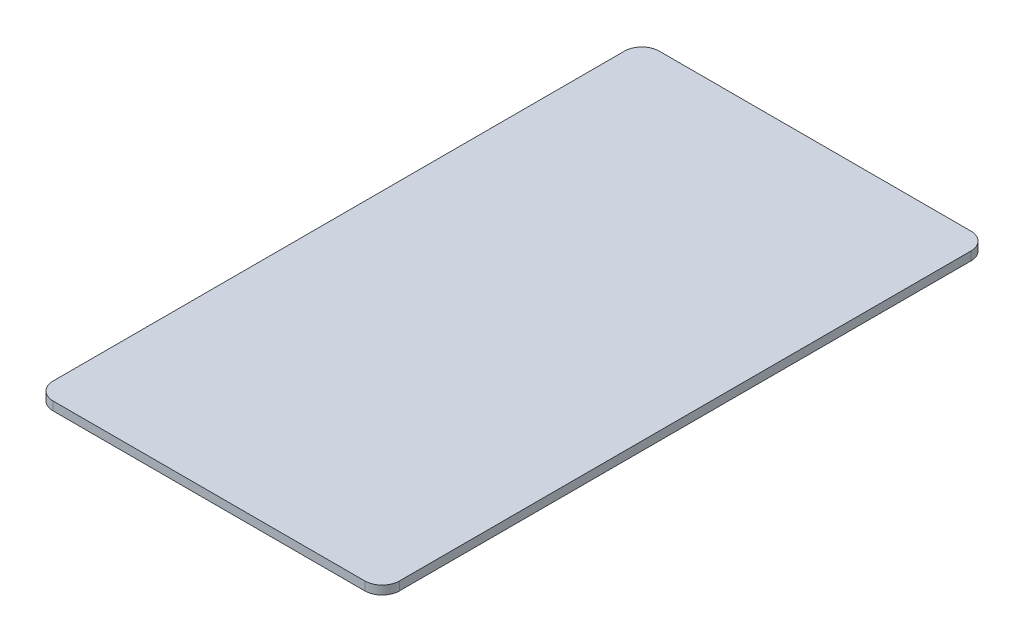
ISO-10303-21;
HEADER;
FILE_DESCRIPTION(('STEP AP214'),'2;1');
FILE_NAME('part.step','',(''),(''),'','','');
FILE_SCHEMA(('AUTOMOTIVE_DESIGN { 1 0 10303 214 1 1 1 1 }'));
ENDSEC;
DATA;
#1=APPLICATION_CONTEXT('core data for automotive mechanical design processes');
#2=APPLICATION_PROTOCOL_DEFINITION('international standard','automotive_design',2000,#1);
#3=PRODUCT_CONTEXT('',#1,'mechanical');
#4=PRODUCT('Part','Part','',(#3));
#5=PRODUCT_RELATED_PRODUCT_CATEGORY('part','',(#4));
#6=PRODUCT_DEFINITION_FORMATION('','',#4);
#7=PRODUCT_DEFINITION_CONTEXT('part definition',#1,'design');
#8=PRODUCT_DEFINITION('design','',#6,#7);
#9=PRODUCT_DEFINITION_SHAPE('','',#8);
#10=(LENGTH_UNIT() NAMED_UNIT(*) SI_UNIT(.MILLI.,.METRE.));
#11=(NAMED_UNIT(*) PLANE_ANGLE_UNIT() SI_UNIT($,.RADIAN.));
#12=(NAMED_UNIT(*) SI_UNIT($,.STERADIAN.) SOLID_ANGLE_UNIT());
#13=UNCERTAINTY_MEASURE_WITH_UNIT(LENGTH_MEASURE(1.E-05),#10,'distance_accuracy_value','');
#14=(GEOMETRIC_REPRESENTATION_CONTEXT(3) GLOBAL_UNCERTAINTY_ASSIGNED_CONTEXT((#13)) GLOBAL_UNIT_ASSIGNED_CONTEXT((#10,
#11,#12)) REPRESENTATION_CONTEXT('',''));
#15=CARTESIAN_POINT('',(0.,0.,0.));
#16=DIRECTION('',(0.,0.,1.));
#17=DIRECTION('',(1.,0.,0.));
#18=AXIS2_PLACEMENT_3D('',#15,#16,#17);
#19=CARTESIAN_POINT('',(20.,1.,35.));
#20=DIRECTION('',(-1.,0.,0.));
#21=DIRECTION('',(0.,0.,1.));
#22=AXIS2_PLACEMENT_3D('',#19,#20,#21);
#23=PLANE('',#22);
#24=DIRECTION('',(0.,0.,-1.));
#25=VECTOR('',#24,1.);
#26=CARTESIAN_POINT('',(20.,1.,35.));
#27=LINE('',#26,#25);
#28=CARTESIAN_POINT('',(20.,1.,33.));
#29=VERTEX_POINT('',#28);
#30=CARTESIAN_POINT('',(20.,1.,-33.));
#31=VERTEX_POINT('',#30);
#32=EDGE_CURVE('E140',#29,#31,#27,.T.);
#33=ORIENTED_EDGE('',*,*,#32,.F.);
#34=DIRECTION('',(0.,-1.,0.));
#35=VECTOR('',#34,1.);
#36=CARTESIAN_POINT('',(20.,1.,33.));
#37=LINE('',#36,#35);
#38=CARTESIAN_POINT('',(20.,0.,33.));
#39=VERTEX_POINT('',#38);
#40=EDGE_CURVE('E124',#29,#39,#37,.T.);
#41=ORIENTED_EDGE('',*,*,#40,.T.);
#42=DIRECTION('',(0.,0.,-1.));
#43=VECTOR('',#42,1.);
#44=CARTESIAN_POINT('',(20.,0.,35.));
#45=LINE('',#44,#43);
#46=CARTESIAN_POINT('',(20.,0.,-33.));
#47=VERTEX_POINT('',#46);
#48=EDGE_CURVE('E137',#39,#47,#45,.T.);
#49=ORIENTED_EDGE('',*,*,#48,.T.);
#50=DIRECTION('',(0.,-1.,0.));
#51=VECTOR('',#50,1.);
#52=CARTESIAN_POINT('',(20.,1.,-33.));
#53=LINE('',#52,#51);
#54=EDGE_CURVE('E143',#47,#31,#53,.F.);
#55=ORIENTED_EDGE('',*,*,#54,.T.);
#56=EDGE_LOOP('',(#33,#41,#49,#55));
#57=FACE_BOUND('',#56,.T.);
#58=ADVANCED_FACE('F52',(#57),#23,.F.);
#59=CARTESIAN_POINT('',(-20.,1.,-35.));
#60=DIRECTION('',(0.,0.,1.));
#61=DIRECTION('',(1.,0.,0.));
#62=AXIS2_PLACEMENT_3D('',#59,#60,#61);
#63=PLANE('',#62);
#64=DIRECTION('',(-1.,0.,0.));
#65=VECTOR('',#64,1.);
#66=CARTESIAN_POINT('',(-20.,1.,-35.));
#67=LINE('',#66,#65);
#68=CARTESIAN_POINT('',(18.,1.,-35.));
#69=VERTEX_POINT('',#68);
#70=CARTESIAN_POINT('',(-18.,1.,-35.));
#71=VERTEX_POINT('',#70);
#72=EDGE_CURVE('E200',#69,#71,#67,.T.);
#73=ORIENTED_EDGE('',*,*,#72,.F.);
#74=DIRECTION('',(0.,-1.,0.));
#75=VECTOR('',#74,1.);
#76=CARTESIAN_POINT('',(18.,1.,-35.));
#77=LINE('',#76,#75);
#78=CARTESIAN_POINT('',(18.,0.,-35.));
#79=VERTEX_POINT('',#78);
#80=EDGE_CURVE('E13',#69,#79,#77,.T.);
#81=ORIENTED_EDGE('',*,*,#80,.T.);
#82=DIRECTION('',(-1.,0.,0.));
#83=VECTOR('',#82,1.);
#84=CARTESIAN_POINT('',(-20.,0.,-35.));
#85=LINE('',#84,#83);
#86=CARTESIAN_POINT('',(-18.,0.,-35.));
#87=VERTEX_POINT('',#86);
#88=EDGE_CURVE('E149',#79,#87,#85,.T.);
#89=ORIENTED_EDGE('',*,*,#88,.T.);
#90=DIRECTION('',(0.,-1.,0.));
#91=VECTOR('',#90,1.);
#92=CARTESIAN_POINT('',(-18.,1.,-35.));
#93=LINE('',#92,#91);
#94=EDGE_CURVE('E61',#87,#71,#93,.F.);
#95=ORIENTED_EDGE('',*,*,#94,.T.);
#96=EDGE_LOOP('',(#73,#81,#89,#95));
#97=FACE_BOUND('',#96,.T.);
#98=ADVANCED_FACE('F199',(#97),#63,.F.);
#99=CARTESIAN_POINT('',(-20.,1.,35.));
#100=DIRECTION('',(1.,0.,0.));
#101=DIRECTION('',(0.,0.,-1.));
#102=AXIS2_PLACEMENT_3D('',#99,#100,#101);
#103=PLANE('',#102);
#104=DIRECTION('',(0.,0.,1.));
#105=VECTOR('',#104,1.);
#106=CARTESIAN_POINT('',(-20.,0.,35.));
#107=LINE('',#106,#105);
#108=CARTESIAN_POINT('',(-20.,0.,-33.));
#109=VERTEX_POINT('',#108);
#110=CARTESIAN_POINT('',(-20.,0.,33.));
#111=VERTEX_POINT('',#110);
#112=EDGE_CURVE('E154',#109,#111,#107,.T.);
#113=ORIENTED_EDGE('',*,*,#112,.T.);
#114=DIRECTION('',(0.,-1.,0.));
#115=VECTOR('',#114,1.);
#116=CARTESIAN_POINT('',(-20.,1.,33.));
#117=LINE('',#116,#115);
#118=CARTESIAN_POINT('',(-20.,1.,33.));
#119=VERTEX_POINT('',#118);
#120=EDGE_CURVE('E68',#111,#119,#117,.F.);
#121=ORIENTED_EDGE('',*,*,#120,.T.);
#122=DIRECTION('',(0.,0.,1.));
#123=VECTOR('',#122,1.);
#124=CARTESIAN_POINT('',(-20.,1.,35.));
#125=LINE('',#124,#123);
#126=CARTESIAN_POINT('',(-20.,1.,-33.));
#127=VERTEX_POINT('',#126);
#128=EDGE_CURVE('E207',#127,#119,#125,.T.);
#129=ORIENTED_EDGE('',*,*,#128,.F.);
#130=DIRECTION('',(0.,-1.,0.));
#131=VECTOR('',#130,1.);
#132=CARTESIAN_POINT('',(-20.,1.,-33.));
#133=LINE('',#132,#131);
#134=EDGE_CURVE('E189',#127,#109,#133,.T.);
#135=ORIENTED_EDGE('',*,*,#134,.T.);
#136=EDGE_LOOP('',(#113,#121,#129,#135));
#137=FACE_BOUND('',#136,.T.);
#138=ADVANCED_FACE('F211',(#137),#103,.F.);
#139=CARTESIAN_POINT('',(-20.,1.,35.));
#140=DIRECTION('',(0.,0.,-1.));
#141=DIRECTION('',(-1.,0.,0.));
#142=AXIS2_PLACEMENT_3D('',#139,#140,#141);
#143=PLANE('',#142);
#144=DIRECTION('',(1.,0.,0.));
#145=VECTOR('',#144,1.);
#146=CARTESIAN_POINT('',(-20.,0.,35.));
#147=LINE('',#146,#145);
#148=CARTESIAN_POINT('',(-18.,0.,35.));
#149=VERTEX_POINT('',#148);
#150=CARTESIAN_POINT('',(18.,0.,35.));
#151=VERTEX_POINT('',#150);
#152=EDGE_CURVE('E162',#149,#151,#147,.T.);
#153=ORIENTED_EDGE('',*,*,#152,.T.);
#154=DIRECTION('',(0.,-1.,0.));
#155=VECTOR('',#154,1.);
#156=CARTESIAN_POINT('',(18.,1.,35.));
#157=LINE('',#156,#155);
#158=CARTESIAN_POINT('',(18.,1.,35.));
#159=VERTEX_POINT('',#158);
#160=EDGE_CURVE('E125',#151,#159,#157,.F.);
#161=ORIENTED_EDGE('',*,*,#160,.T.);
#162=DIRECTION('',(1.,0.,0.));
#163=VECTOR('',#162,1.);
#164=CARTESIAN_POINT('',(-20.,1.,35.));
#165=LINE('',#164,#163);
#166=CARTESIAN_POINT('',(-18.,1.,35.));
#167=VERTEX_POINT('',#166);
#168=EDGE_CURVE('E157',#167,#159,#165,.T.);
#169=ORIENTED_EDGE('',*,*,#168,.F.);
#170=DIRECTION('',(0.,-1.,0.));
#171=VECTOR('',#170,1.);
#172=CARTESIAN_POINT('',(-18.,1.,35.));
#173=LINE('',#172,#171);
#174=EDGE_CURVE('E131',#167,#149,#173,.T.);
#175=ORIENTED_EDGE('',*,*,#174,.T.);
#176=EDGE_LOOP('',(#153,#161,#169,#175));
#177=FACE_BOUND('',#176,.T.);
#178=ADVANCED_FACE('F218',(#177),#143,.F.);
#179=CARTESIAN_POINT('',(0.,1.,0.));
#180=DIRECTION('',(0.,-1.,0.));
#181=DIRECTION('',(0.,0.,-1.));
#182=AXIS2_PLACEMENT_3D('',#179,#180,#181);
#183=PLANE('',#182);
#184=ORIENTED_EDGE('',*,*,#168,.T.);
#185=CARTESIAN_POINT('',(18.,1.,33.));
#186=DIRECTION('',(0.,-1.,0.));
#187=DIRECTION('',(0.,0.,-1.));
#188=AXIS2_PLACEMENT_3D('',#185,#186,#187);
#189=CIRCLE('',#188,2.);
#190=EDGE_CURVE('E186',#159,#29,#189,.F.);
#191=ORIENTED_EDGE('',*,*,#190,.T.);
#192=ORIENTED_EDGE('',*,*,#32,.T.);
#193=CARTESIAN_POINT('',(18.,1.,-33.));
#194=DIRECTION('',(0.,-1.,0.));
#195=DIRECTION('',(0.,0.,-1.));
#196=AXIS2_PLACEMENT_3D('',#193,#194,#195);
#197=CIRCLE('',#196,2.);
#198=EDGE_CURVE('E180',#31,#69,#197,.F.);
#199=ORIENTED_EDGE('',*,*,#198,.T.);
#200=ORIENTED_EDGE('',*,*,#72,.T.);
#201=CARTESIAN_POINT('',(-18.,1.,-33.));
#202=DIRECTION('',(0.,-1.,0.));
#203=DIRECTION('',(0.,0.,-1.));
#204=AXIS2_PLACEMENT_3D('',#201,#202,#203);
#205=CIRCLE('',#204,2.);
#206=EDGE_CURVE('E75',#71,#127,#205,.F.);
#207=ORIENTED_EDGE('',*,*,#206,.T.);
#208=ORIENTED_EDGE('',*,*,#128,.T.);
#209=CARTESIAN_POINT('',(-18.,1.,33.));
#210=DIRECTION('',(0.,-1.,0.));
#211=DIRECTION('',(0.,0.,-1.));
#212=AXIS2_PLACEMENT_3D('',#209,#210,#211);
#213=CIRCLE('',#212,2.);
#214=EDGE_CURVE('E183',#119,#167,#213,.F.);
#215=ORIENTED_EDGE('',*,*,#214,.T.);
#216=EDGE_LOOP('',(#184,#191,#192,#199,#200,#207,#208,#215));
#217=FACE_BOUND('',#216,.T.);
#218=ADVANCED_FACE('F204',(#217),#183,.F.);
#219=CARTESIAN_POINT('',(0.,0.,0.));
#220=DIRECTION('',(0.,-1.,0.));
#221=DIRECTION('',(0.,0.,-1.));
#222=AXIS2_PLACEMENT_3D('',#219,#220,#221);
#223=PLANE('',#222);
#224=ORIENTED_EDGE('',*,*,#48,.F.);
#225=CARTESIAN_POINT('',(18.,0.,33.));
#226=DIRECTION('',(0.,-1.,0.));
#227=DIRECTION('',(0.,0.,-1.));
#228=AXIS2_PLACEMENT_3D('',#225,#226,#227);
#229=CIRCLE('',#228,2.);
#230=EDGE_CURVE('E120',#39,#151,#229,.T.);
#231=ORIENTED_EDGE('',*,*,#230,.T.);
#232=ORIENTED_EDGE('',*,*,#152,.F.);
#233=CARTESIAN_POINT('',(-18.,0.,33.));
#234=DIRECTION('',(0.,-1.,0.));
#235=DIRECTION('',(0.,0.,-1.));
#236=AXIS2_PLACEMENT_3D('',#233,#234,#235);
#237=CIRCLE('',#236,2.);
#238=EDGE_CURVE('E132',#149,#111,#237,.T.);
#239=ORIENTED_EDGE('',*,*,#238,.T.);
#240=ORIENTED_EDGE('',*,*,#112,.F.);
#241=CARTESIAN_POINT('',(-18.,0.,-33.));
#242=DIRECTION('',(0.,-1.,0.));
#243=DIRECTION('',(0.,0.,-1.));
#244=AXIS2_PLACEMENT_3D('',#241,#242,#243);
#245=CIRCLE('',#244,2.);
#246=EDGE_CURVE('E142',#109,#87,#245,.T.);
#247=ORIENTED_EDGE('',*,*,#246,.T.);
#248=ORIENTED_EDGE('',*,*,#88,.F.);
#249=CARTESIAN_POINT('',(18.,0.,-33.));
#250=DIRECTION('',(0.,-1.,0.));
#251=DIRECTION('',(0.,0.,-1.));
#252=AXIS2_PLACEMENT_3D('',#249,#250,#251);
#253=CIRCLE('',#252,2.);
#254=EDGE_CURVE('E147',#79,#47,#253,.T.);
#255=ORIENTED_EDGE('',*,*,#254,.T.);
#256=EDGE_LOOP('',(#224,#231,#232,#239,#240,#247,#248,#255));
#257=FACE_BOUND('',#256,.T.);
#258=ADVANCED_FACE('F145',(#257),#223,.T.);
#259=CARTESIAN_POINT('',(18.,1.,33.));
#260=DIRECTION('',(0.,-1.,0.));
#261=DIRECTION('',(0.,0.,-1.));
#262=AXIS2_PLACEMENT_3D('',#259,#260,#261);
#263=CYLINDRICAL_SURFACE('',#262,2.);
#264=ORIENTED_EDGE('',*,*,#190,.F.);
#265=ORIENTED_EDGE('',*,*,#160,.F.);
#266=ORIENTED_EDGE('',*,*,#230,.F.);
#267=ORIENTED_EDGE('',*,*,#40,.F.);
#268=EDGE_LOOP('',(#264,#265,#266,#267));
#269=FACE_BOUND('',#268,.T.);
#270=ADVANCED_FACE('F123',(#269),#263,.T.);
#271=CARTESIAN_POINT('',(-18.,1.,33.));
#272=DIRECTION('',(0.,-1.,0.));
#273=DIRECTION('',(0.,0.,-1.));
#274=AXIS2_PLACEMENT_3D('',#271,#272,#273);
#275=CYLINDRICAL_SURFACE('',#274,2.);
#276=ORIENTED_EDGE('',*,*,#214,.F.);
#277=ORIENTED_EDGE('',*,*,#120,.F.);
#278=ORIENTED_EDGE('',*,*,#238,.F.);
#279=ORIENTED_EDGE('',*,*,#174,.F.);
#280=EDGE_LOOP('',(#276,#277,#278,#279));
#281=FACE_BOUND('',#280,.T.);
#282=ADVANCED_FACE('F215',(#281),#275,.T.);
#283=CARTESIAN_POINT('',(18.,1.,-33.));
#284=DIRECTION('',(0.,-1.,0.));
#285=DIRECTION('',(0.,0.,-1.));
#286=AXIS2_PLACEMENT_3D('',#283,#284,#285);
#287=CYLINDRICAL_SURFACE('',#286,2.);
#288=ORIENTED_EDGE('',*,*,#198,.F.);
#289=ORIENTED_EDGE('',*,*,#54,.F.);
#290=ORIENTED_EDGE('',*,*,#254,.F.);
#291=ORIENTED_EDGE('',*,*,#80,.F.);
#292=EDGE_LOOP('',(#288,#289,#290,#291));
#293=FACE_BOUND('',#292,.T.);
#294=ADVANCED_FACE('F227',(#293),#287,.T.);
#295=CARTESIAN_POINT('',(-18.,1.,-33.));
#296=DIRECTION('',(0.,-1.,0.));
#297=DIRECTION('',(0.,0.,-1.));
#298=AXIS2_PLACEMENT_3D('',#295,#296,#297);
#299=CYLINDRICAL_SURFACE('',#298,2.);
#300=ORIENTED_EDGE('',*,*,#206,.F.);
#301=ORIENTED_EDGE('',*,*,#94,.F.);
#302=ORIENTED_EDGE('',*,*,#246,.F.);
#303=ORIENTED_EDGE('',*,*,#134,.F.);
#304=EDGE_LOOP('',(#300,#301,#302,#303));
#305=FACE_BOUND('',#304,.T.);
#306=ADVANCED_FACE('F54',(#305),#299,.T.);
#307=CLOSED_SHELL('',(#58,#98,#138,#178,#218,#258,#270,#282,#294,#306));
#308=MANIFOLD_SOLID_BREP('B2',#307);
#309=ADVANCED_BREP_SHAPE_REPRESENTATION('',(#18,#308),#14);
#310=SHAPE_DEFINITION_REPRESENTATION(#9,#309);
ENDSEC;
END-ISO-10303-21;
